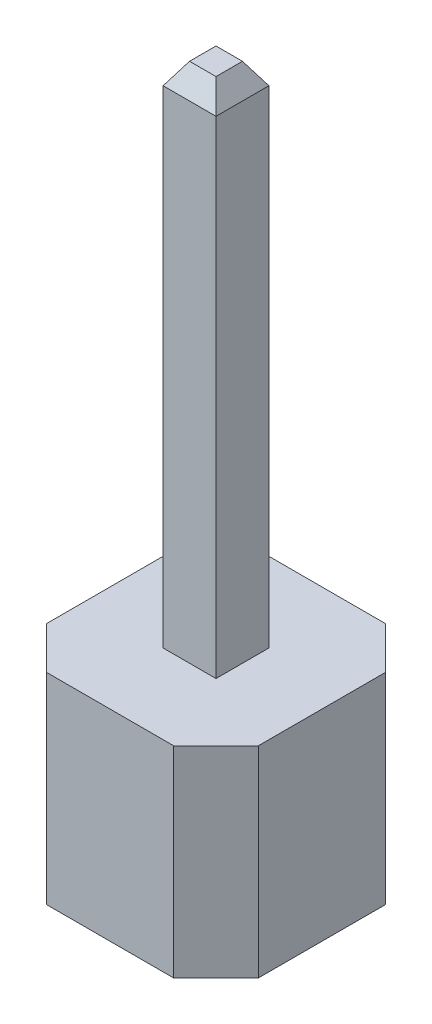
ISO-10303-21;
HEADER;
FILE_DESCRIPTION(('STEP AP214'),'2;1');
FILE_NAME('part.step','',(''),(''),'','','');
FILE_SCHEMA(('AUTOMOTIVE_DESIGN { 1 0 10303 214 1 1 1 1 }'));
ENDSEC;
DATA;
#1=APPLICATION_CONTEXT('core data for automotive mechanical design processes');
#2=APPLICATION_PROTOCOL_DEFINITION('international standard','automotive_design',2000,#1);
#3=PRODUCT_CONTEXT('',#1,'mechanical');
#4=PRODUCT('Part','Part','',(#3));
#5=PRODUCT_RELATED_PRODUCT_CATEGORY('part','',(#4));
#6=PRODUCT_DEFINITION_FORMATION('','',#4);
#7=PRODUCT_DEFINITION_CONTEXT('part definition',#1,'design');
#8=PRODUCT_DEFINITION('design','',#6,#7);
#9=PRODUCT_DEFINITION_SHAPE('','',#8);
#10=(LENGTH_UNIT() NAMED_UNIT(*) SI_UNIT(.MILLI.,.METRE.));
#11=(NAMED_UNIT(*) PLANE_ANGLE_UNIT() SI_UNIT($,.RADIAN.));
#12=(NAMED_UNIT(*) SI_UNIT($,.STERADIAN.) SOLID_ANGLE_UNIT());
#13=UNCERTAINTY_MEASURE_WITH_UNIT(LENGTH_MEASURE(1.E-05),#10,'distance_accuracy_value','');
#14=(GEOMETRIC_REPRESENTATION_CONTEXT(3) GLOBAL_UNCERTAINTY_ASSIGNED_CONTEXT((#13)) GLOBAL_UNIT_ASSIGNED_CONTEXT((#10,
#11,#12)) REPRESENTATION_CONTEXT('',''));
#15=CARTESIAN_POINT('',(0.,0.,0.));
#16=DIRECTION('',(0.,0.,1.));
#17=DIRECTION('',(1.,0.,0.));
#18=AXIS2_PLACEMENT_3D('',#15,#16,#17);
#19=CARTESIAN_POINT('',(0.,2.413,0.));
#20=DIRECTION('',(0.,1.,0.));
#21=DIRECTION('',(0.,0.,1.));
#22=AXIS2_PLACEMENT_3D('',#19,#20,#21);
#23=PLANE('',#22);
#24=DIRECTION('',(0.,0.,1.));
#25=VECTOR('',#24,1.);
#26=CARTESIAN_POINT('',(-1.27,2.413,-1.27));
#27=LINE('',#26,#25);
#28=CARTESIAN_POINT('',(-1.27,2.413,-0.761999999999999));
#29=VERTEX_POINT('',#28);
#30=CARTESIAN_POINT('',(-1.27,2.413,0.761999999999999));
#31=VERTEX_POINT('',#30);
#32=EDGE_CURVE('E171',#29,#31,#27,.T.);
#33=ORIENTED_EDGE('',*,*,#32,.T.);
#34=DIRECTION('',(-0.707106781186546,0.,-0.707106781186549));
#35=VECTOR('',#34,1.);
#36=CARTESIAN_POINT('',(-1.016,2.413,1.016));
#37=LINE('',#36,#35);
#38=CARTESIAN_POINT('',(-0.762,2.413,1.27));
#39=VERTEX_POINT('',#38);
#40=EDGE_CURVE('E211',#31,#39,#37,.F.);
#41=ORIENTED_EDGE('',*,*,#40,.T.);
#42=DIRECTION('',(1.,0.,0.));
#43=VECTOR('',#42,1.);
#44=CARTESIAN_POINT('',(-1.27,2.413,1.27));
#45=LINE('',#44,#43);
#46=CARTESIAN_POINT('',(0.761999999999999,2.413,1.27));
#47=VERTEX_POINT('',#46);
#48=EDGE_CURVE('E174',#39,#47,#45,.T.);
#49=ORIENTED_EDGE('',*,*,#48,.T.);
#50=DIRECTION('',(-0.707106781186549,0.,0.707106781186546));
#51=VECTOR('',#50,1.);
#52=CARTESIAN_POINT('',(1.016,2.413,1.016));
#53=LINE('',#52,#51);
#54=CARTESIAN_POINT('',(1.27,2.413,0.762));
#55=VERTEX_POINT('',#54);
#56=EDGE_CURVE('E205',#47,#55,#53,.F.);
#57=ORIENTED_EDGE('',*,*,#56,.T.);
#58=DIRECTION('',(0.,0.,-1.));
#59=VECTOR('',#58,1.);
#60=CARTESIAN_POINT('',(1.27,2.413,-1.27));
#61=LINE('',#60,#59);
#62=CARTESIAN_POINT('',(1.27,2.413,-0.761999999999998));
#63=VERTEX_POINT('',#62);
#64=EDGE_CURVE('E164',#55,#63,#61,.T.);
#65=ORIENTED_EDGE('',*,*,#64,.T.);
#66=DIRECTION('',(0.707106781186547,0.,0.707106781186548));
#67=VECTOR('',#66,1.);
#68=CARTESIAN_POINT('',(1.016,2.413,-1.016));
#69=LINE('',#68,#67);
#70=CARTESIAN_POINT('',(0.762000000000001,2.413,-1.27));
#71=VERTEX_POINT('',#70);
#72=EDGE_CURVE('E207',#63,#71,#69,.F.);
#73=ORIENTED_EDGE('',*,*,#72,.T.);
#74=DIRECTION('',(-1.,0.,0.));
#75=VECTOR('',#74,1.);
#76=CARTESIAN_POINT('',(-1.27,2.413,-1.27));
#77=LINE('',#76,#75);
#78=CARTESIAN_POINT('',(-0.761999999999997,2.413,-1.27));
#79=VERTEX_POINT('',#78);
#80=EDGE_CURVE('E167',#71,#79,#77,.T.);
#81=ORIENTED_EDGE('',*,*,#80,.T.);
#82=DIRECTION('',(0.707106781186549,0.,-0.707106781186546));
#83=VECTOR('',#82,1.);
#84=CARTESIAN_POINT('',(-1.016,2.413,-1.016));
#85=LINE('',#84,#83);
#86=EDGE_CURVE('E209',#79,#29,#85,.F.);
#87=ORIENTED_EDGE('',*,*,#86,.T.);
#88=EDGE_LOOP('',(#33,#41,#49,#57,#65,#73,#81,#87));
#89=FACE_BOUND('',#88,.T.);
#90=DIRECTION('',(-1.,0.,0.));
#91=VECTOR('',#90,1.);
#92=CARTESIAN_POINT('',(-0.3175,2.413,-0.3175));
#93=LINE('',#92,#91);
#94=CARTESIAN_POINT('',(0.3175,2.413,-0.3175));
#95=VERTEX_POINT('',#94);
#96=CARTESIAN_POINT('',(-0.3175,2.413,-0.3175));
#97=VERTEX_POINT('',#96);
#98=EDGE_CURVE('E137',#95,#97,#93,.T.);
#99=ORIENTED_EDGE('',*,*,#98,.F.);
#100=DIRECTION('',(0.,0.,-1.));
#101=VECTOR('',#100,1.);
#102=CARTESIAN_POINT('',(0.3175,2.413,0.3175));
#103=LINE('',#102,#101);
#104=CARTESIAN_POINT('',(0.3175,2.413,0.3175));
#105=VERTEX_POINT('',#104);
#106=EDGE_CURVE('E145',#105,#95,#103,.T.);
#107=ORIENTED_EDGE('',*,*,#106,.F.);
#108=DIRECTION('',(1.,0.,0.));
#109=VECTOR('',#108,1.);
#110=CARTESIAN_POINT('',(-0.3175,2.413,0.3175));
#111=LINE('',#110,#109);
#112=CARTESIAN_POINT('',(-0.3175,2.413,0.3175));
#113=VERTEX_POINT('',#112);
#114=EDGE_CURVE('E156',#113,#105,#111,.T.);
#115=ORIENTED_EDGE('',*,*,#114,.F.);
#116=DIRECTION('',(0.,0.,1.));
#117=VECTOR('',#116,1.);
#118=CARTESIAN_POINT('',(-0.3175,2.413,0.3175));
#119=LINE('',#118,#117);
#120=EDGE_CURVE('E154',#97,#113,#119,.T.);
#121=ORIENTED_EDGE('',*,*,#120,.F.);
#122=EDGE_LOOP('',(#99,#107,#115,#121));
#123=FACE_BOUND('',#122,.T.);
#124=ADVANCED_FACE('F33',(#89,#123),#23,.T.);
#125=CARTESIAN_POINT('',(1.27,2.413,-1.27));
#126=DIRECTION('',(-1.,0.,0.));
#127=DIRECTION('',(0.,0.,1.));
#128=AXIS2_PLACEMENT_3D('',#125,#126,#127);
#129=PLANE('',#128);
#130=DIRECTION('',(0.,0.,-1.));
#131=VECTOR('',#130,1.);
#132=CARTESIAN_POINT('',(1.27,0.,-1.27));
#133=LINE('',#132,#131);
#134=CARTESIAN_POINT('',(1.27,0.,0.762));
#135=VERTEX_POINT('',#134);
#136=CARTESIAN_POINT('',(1.27,0.,-0.761999999999998));
#137=VERTEX_POINT('',#136);
#138=EDGE_CURVE('E141',#135,#137,#133,.T.);
#139=ORIENTED_EDGE('',*,*,#138,.T.);
#140=DIRECTION('',(0.,1.,0.));
#141=VECTOR('',#140,1.);
#142=CARTESIAN_POINT('',(1.27,2.413,-0.761999999999998));
#143=LINE('',#142,#141);
#144=EDGE_CURVE('E221',#137,#63,#143,.T.);
#145=ORIENTED_EDGE('',*,*,#144,.T.);
#146=ORIENTED_EDGE('',*,*,#64,.F.);
#147=DIRECTION('',(0.,-1.,0.));
#148=VECTOR('',#147,1.);
#149=CARTESIAN_POINT('',(1.27,2.413,0.762000000000001));
#150=LINE('',#149,#148);
#151=EDGE_CURVE('E218',#55,#135,#150,.T.);
#152=ORIENTED_EDGE('',*,*,#151,.T.);
#153=EDGE_LOOP('',(#139,#145,#146,#152));
#154=FACE_BOUND('',#153,.T.);
#155=ADVANCED_FACE('F272',(#154),#129,.F.);
#156=CARTESIAN_POINT('',(-1.27,2.413,-1.27));
#157=DIRECTION('',(0.,0.,1.));
#158=DIRECTION('',(1.,0.,0.));
#159=AXIS2_PLACEMENT_3D('',#156,#157,#158);
#160=PLANE('',#159);
#161=DIRECTION('',(-1.,0.,0.));
#162=VECTOR('',#161,1.);
#163=CARTESIAN_POINT('',(-1.27,0.,-1.27));
#164=LINE('',#163,#162);
#165=CARTESIAN_POINT('',(0.762000000000001,0.,-1.27));
#166=VERTEX_POINT('',#165);
#167=CARTESIAN_POINT('',(-0.761999999999997,0.,-1.27));
#168=VERTEX_POINT('',#167);
#169=EDGE_CURVE('E180',#166,#168,#164,.T.);
#170=ORIENTED_EDGE('',*,*,#169,.T.);
#171=DIRECTION('',(0.,1.,0.));
#172=VECTOR('',#171,1.);
#173=CARTESIAN_POINT('',(-0.761999999999997,2.413,-1.27));
#174=LINE('',#173,#172);
#175=EDGE_CURVE('E216',#168,#79,#174,.T.);
#176=ORIENTED_EDGE('',*,*,#175,.T.);
#177=ORIENTED_EDGE('',*,*,#80,.F.);
#178=DIRECTION('',(0.,-1.,0.));
#179=VECTOR('',#178,1.);
#180=CARTESIAN_POINT('',(0.762,2.413,-1.27));
#181=LINE('',#180,#179);
#182=EDGE_CURVE('E213',#71,#166,#181,.T.);
#183=ORIENTED_EDGE('',*,*,#182,.T.);
#184=EDGE_LOOP('',(#170,#176,#177,#183));
#185=FACE_BOUND('',#184,.T.);
#186=ADVANCED_FACE('F278',(#185),#160,.F.);
#187=CARTESIAN_POINT('',(-1.27,2.413,-1.27));
#188=DIRECTION('',(1.,0.,0.));
#189=DIRECTION('',(0.,0.,-1.));
#190=AXIS2_PLACEMENT_3D('',#187,#188,#189);
#191=PLANE('',#190);
#192=DIRECTION('',(0.,0.,1.));
#193=VECTOR('',#192,1.);
#194=CARTESIAN_POINT('',(-1.27,0.,-1.27));
#195=LINE('',#194,#193);
#196=CARTESIAN_POINT('',(-1.27,0.,-0.761999999999999));
#197=VERTEX_POINT('',#196);
#198=CARTESIAN_POINT('',(-1.27,0.,0.761999999999999));
#199=VERTEX_POINT('',#198);
#200=EDGE_CURVE('E183',#197,#199,#195,.T.);
#201=ORIENTED_EDGE('',*,*,#200,.T.);
#202=DIRECTION('',(0.,1.,0.));
#203=VECTOR('',#202,1.);
#204=CARTESIAN_POINT('',(-1.27,2.413,0.761999999999999));
#205=LINE('',#204,#203);
#206=EDGE_CURVE('E203',#199,#31,#205,.T.);
#207=ORIENTED_EDGE('',*,*,#206,.T.);
#208=ORIENTED_EDGE('',*,*,#32,.F.);
#209=DIRECTION('',(0.,-1.,0.));
#210=VECTOR('',#209,1.);
#211=CARTESIAN_POINT('',(-1.27,2.413,-0.761999999999999));
#212=LINE('',#211,#210);
#213=EDGE_CURVE('E200',#29,#197,#212,.T.);
#214=ORIENTED_EDGE('',*,*,#213,.T.);
#215=EDGE_LOOP('',(#201,#207,#208,#214));
#216=FACE_BOUND('',#215,.T.);
#217=ADVANCED_FACE('F292',(#216),#191,.F.);
#218=CARTESIAN_POINT('',(-1.27,2.413,1.27));
#219=DIRECTION('',(0.,0.,-1.));
#220=DIRECTION('',(-1.,0.,0.));
#221=AXIS2_PLACEMENT_3D('',#218,#219,#220);
#222=PLANE('',#221);
#223=ORIENTED_EDGE('',*,*,#48,.F.);
#224=DIRECTION('',(0.,-1.,0.));
#225=VECTOR('',#224,1.);
#226=CARTESIAN_POINT('',(-0.762,2.413,1.27));
#227=LINE('',#226,#225);
#228=CARTESIAN_POINT('',(-0.762,0.,1.27));
#229=VERTEX_POINT('',#228);
#230=EDGE_CURVE('E189',#39,#229,#227,.T.);
#231=ORIENTED_EDGE('',*,*,#230,.T.);
#232=DIRECTION('',(1.,0.,0.));
#233=VECTOR('',#232,1.);
#234=CARTESIAN_POINT('',(-1.27,0.,1.27));
#235=LINE('',#234,#233);
#236=CARTESIAN_POINT('',(0.762,0.,1.27));
#237=VERTEX_POINT('',#236);
#238=EDGE_CURVE('E168',#229,#237,#235,.T.);
#239=ORIENTED_EDGE('',*,*,#238,.T.);
#240=DIRECTION('',(0.,1.,0.));
#241=VECTOR('',#240,1.);
#242=CARTESIAN_POINT('',(0.762,2.413,1.27));
#243=LINE('',#242,#241);
#244=EDGE_CURVE('E177',#237,#47,#243,.T.);
#245=ORIENTED_EDGE('',*,*,#244,.T.);
#246=EDGE_LOOP('',(#223,#231,#239,#245));
#247=FACE_BOUND('',#246,.T.);
#248=ADVANCED_FACE('F288',(#247),#222,.F.);
#249=CARTESIAN_POINT('',(0.,0.,0.));
#250=DIRECTION('',(0.,1.,0.));
#251=DIRECTION('',(0.,0.,1.));
#252=AXIS2_PLACEMENT_3D('',#249,#250,#251);
#253=PLANE('',#252);
#254=ORIENTED_EDGE('',*,*,#238,.F.);
#255=DIRECTION('',(0.707106781186546,0.,0.707106781186549));
#256=VECTOR('',#255,1.);
#257=CARTESIAN_POINT('',(-0.762,0.,1.27));
#258=LINE('',#257,#256);
#259=EDGE_CURVE('E198',#229,#199,#258,.F.);
#260=ORIENTED_EDGE('',*,*,#259,.T.);
#261=ORIENTED_EDGE('',*,*,#200,.F.);
#262=DIRECTION('',(-0.707106781186549,0.,0.707106781186546));
#263=VECTOR('',#262,1.);
#264=CARTESIAN_POINT('',(-1.27,0.,-0.761999999999999));
#265=LINE('',#264,#263);
#266=EDGE_CURVE('E196',#197,#168,#265,.F.);
#267=ORIENTED_EDGE('',*,*,#266,.T.);
#268=ORIENTED_EDGE('',*,*,#169,.F.);
#269=DIRECTION('',(-0.707106781186547,0.,-0.707106781186548));
#270=VECTOR('',#269,1.);
#271=CARTESIAN_POINT('',(0.762,0.,-1.27));
#272=LINE('',#271,#270);
#273=EDGE_CURVE('E194',#166,#137,#272,.F.);
#274=ORIENTED_EDGE('',*,*,#273,.T.);
#275=ORIENTED_EDGE('',*,*,#138,.F.);
#276=DIRECTION('',(0.707106781186549,0.,-0.707106781186546));
#277=VECTOR('',#276,1.);
#278=CARTESIAN_POINT('',(1.27,0.,0.762000000000001));
#279=LINE('',#278,#277);
#280=EDGE_CURVE('E192',#135,#237,#279,.F.);
#281=ORIENTED_EDGE('',*,*,#280,.T.);
#282=EDGE_LOOP('',(#254,#260,#261,#267,#268,#274,#275,#281));
#283=FACE_BOUND('',#282,.T.);
#284=ADVANCED_FACE('F284',(#283),#253,.F.);
#285=CARTESIAN_POINT('',(-0.762,2.413,1.27));
#286=DIRECTION('',(0.707106781186549,0.,-0.707106781186546));
#287=DIRECTION('',(0.,-1.,0.));
#288=AXIS2_PLACEMENT_3D('',#285,#286,#287);
#289=PLANE('',#288);
#290=ORIENTED_EDGE('',*,*,#40,.F.);
#291=ORIENTED_EDGE('',*,*,#206,.F.);
#292=ORIENTED_EDGE('',*,*,#259,.F.);
#293=ORIENTED_EDGE('',*,*,#230,.F.);
#294=EDGE_LOOP('',(#290,#291,#292,#293));
#295=FACE_BOUND('',#294,.T.);
#296=ADVANCED_FACE('F287',(#295),#289,.F.);
#297=CARTESIAN_POINT('',(-1.27,2.413,-0.761999999999999));
#298=DIRECTION('',(0.707106781186546,0.,0.707106781186549));
#299=DIRECTION('',(0.,-1.,0.));
#300=AXIS2_PLACEMENT_3D('',#297,#298,#299);
#301=PLANE('',#300);
#302=ORIENTED_EDGE('',*,*,#86,.F.);
#303=ORIENTED_EDGE('',*,*,#175,.F.);
#304=ORIENTED_EDGE('',*,*,#266,.F.);
#305=ORIENTED_EDGE('',*,*,#213,.F.);
#306=EDGE_LOOP('',(#302,#303,#304,#305));
#307=FACE_BOUND('',#306,.T.);
#308=ADVANCED_FACE('F302',(#307),#301,.F.);
#309=CARTESIAN_POINT('',(0.762,2.413,-1.27));
#310=DIRECTION('',(-0.707106781186548,0.,0.707106781186547));
#311=DIRECTION('',(0.,-1.,0.));
#312=AXIS2_PLACEMENT_3D('',#309,#310,#311);
#313=PLANE('',#312);
#314=ORIENTED_EDGE('',*,*,#72,.F.);
#315=ORIENTED_EDGE('',*,*,#144,.F.);
#316=ORIENTED_EDGE('',*,*,#273,.F.);
#317=ORIENTED_EDGE('',*,*,#182,.F.);
#318=EDGE_LOOP('',(#314,#315,#316,#317));
#319=FACE_BOUND('',#318,.T.);
#320=ADVANCED_FACE('F306',(#319),#313,.F.);
#321=CARTESIAN_POINT('',(1.27,2.413,0.762000000000001));
#322=DIRECTION('',(-0.707106781186546,0.,-0.707106781186549));
#323=DIRECTION('',(0.,-1.,0.));
#324=AXIS2_PLACEMENT_3D('',#321,#322,#323);
#325=PLANE('',#324);
#326=ORIENTED_EDGE('',*,*,#56,.F.);
#327=ORIENTED_EDGE('',*,*,#244,.F.);
#328=ORIENTED_EDGE('',*,*,#280,.F.);
#329=ORIENTED_EDGE('',*,*,#151,.F.);
#330=EDGE_LOOP('',(#326,#327,#328,#329));
#331=FACE_BOUND('',#330,.T.);
#332=ADVANCED_FACE('F310',(#331),#325,.F.);
#333=CARTESIAN_POINT('',(0.3175,8.509,0.3175));
#334=DIRECTION('',(-1.,0.,0.));
#335=DIRECTION('',(0.,0.,1.));
#336=AXIS2_PLACEMENT_3D('',#333,#334,#335);
#337=PLANE('',#336);
#338=DIRECTION('',(0.,-1.,0.));
#339=VECTOR('',#338,1.);
#340=CARTESIAN_POINT('',(0.3175,8.509,-0.3175));
#341=LINE('',#340,#339);
#342=CARTESIAN_POINT('',(0.3175,8.255,-0.3175));
#343=VERTEX_POINT('',#342);
#344=EDGE_CURVE('E133',#343,#95,#341,.T.);
#345=ORIENTED_EDGE('',*,*,#344,.F.);
#346=DIRECTION('',(0.,0.,1.));
#347=VECTOR('',#346,1.);
#348=CARTESIAN_POINT('',(0.3175,8.255,0.3175));
#349=LINE('',#348,#347);
#350=CARTESIAN_POINT('',(0.3175,8.255,0.3175));
#351=VERTEX_POINT('',#350);
#352=EDGE_CURVE('E11',#343,#351,#349,.T.);
#353=ORIENTED_EDGE('',*,*,#352,.T.);
#354=DIRECTION('',(0.,-1.,0.));
#355=VECTOR('',#354,1.);
#356=CARTESIAN_POINT('',(0.3175,8.509,0.3175));
#357=LINE('',#356,#355);
#358=EDGE_CURVE('E148',#351,#105,#357,.T.);
#359=ORIENTED_EDGE('',*,*,#358,.T.);
#360=ORIENTED_EDGE('',*,*,#106,.T.);
#361=EDGE_LOOP('',(#345,#353,#359,#360));
#362=FACE_BOUND('',#361,.T.);
#363=ADVANCED_FACE('F146',(#362),#337,.F.);
#364=CARTESIAN_POINT('',(-0.3175,8.509,-0.3175));
#365=DIRECTION('',(0.,0.,1.));
#366=DIRECTION('',(1.,0.,0.));
#367=AXIS2_PLACEMENT_3D('',#364,#365,#366);
#368=PLANE('',#367);
#369=DIRECTION('',(0.,-1.,0.));
#370=VECTOR('',#369,1.);
#371=CARTESIAN_POINT('',(-0.3175,8.509,-0.3175));
#372=LINE('',#371,#370);
#373=CARTESIAN_POINT('',(-0.3175,8.255,-0.3175));
#374=VERTEX_POINT('',#373);
#375=EDGE_CURVE('E142',#374,#97,#372,.T.);
#376=ORIENTED_EDGE('',*,*,#375,.F.);
#377=DIRECTION('',(1.,0.,0.));
#378=VECTOR('',#377,1.);
#379=CARTESIAN_POINT('',(-0.3175,8.255,-0.3175));
#380=LINE('',#379,#378);
#381=EDGE_CURVE('E42',#374,#343,#380,.T.);
#382=ORIENTED_EDGE('',*,*,#381,.T.);
#383=ORIENTED_EDGE('',*,*,#344,.T.);
#384=ORIENTED_EDGE('',*,*,#98,.T.);
#385=EDGE_LOOP('',(#376,#382,#383,#384));
#386=FACE_BOUND('',#385,.T.);
#387=ADVANCED_FACE('F135',(#386),#368,.F.);
#388=CARTESIAN_POINT('',(-0.3175,8.509,0.3175));
#389=DIRECTION('',(1.,0.,0.));
#390=DIRECTION('',(0.,0.,-1.));
#391=AXIS2_PLACEMENT_3D('',#388,#389,#390);
#392=PLANE('',#391);
#393=DIRECTION('',(0.,-1.,0.));
#394=VECTOR('',#393,1.);
#395=CARTESIAN_POINT('',(-0.3175,8.509,0.3175));
#396=LINE('',#395,#394);
#397=CARTESIAN_POINT('',(-0.3175,8.255,0.3175));
#398=VERTEX_POINT('',#397);
#399=EDGE_CURVE('E161',#398,#113,#396,.T.);
#400=ORIENTED_EDGE('',*,*,#399,.F.);
#401=DIRECTION('',(0.,0.,-1.));
#402=VECTOR('',#401,1.);
#403=CARTESIAN_POINT('',(-0.3175,8.255,0.3175));
#404=LINE('',#403,#402);
#405=EDGE_CURVE('E57',#398,#374,#404,.T.);
#406=ORIENTED_EDGE('',*,*,#405,.T.);
#407=ORIENTED_EDGE('',*,*,#375,.T.);
#408=ORIENTED_EDGE('',*,*,#120,.T.);
#409=EDGE_LOOP('',(#400,#406,#407,#408));
#410=FACE_BOUND('',#409,.T.);
#411=ADVANCED_FACE('F269',(#410),#392,.F.);
#412=CARTESIAN_POINT('',(-0.3175,8.509,0.3175));
#413=DIRECTION('',(0.,0.,-1.));
#414=DIRECTION('',(-1.,0.,0.));
#415=AXIS2_PLACEMENT_3D('',#412,#413,#414);
#416=PLANE('',#415);
#417=ORIENTED_EDGE('',*,*,#358,.F.);
#418=DIRECTION('',(-1.,0.,0.));
#419=VECTOR('',#418,1.);
#420=CARTESIAN_POINT('',(-0.3175,8.255,0.3175));
#421=LINE('',#420,#419);
#422=EDGE_CURVE('E232',#351,#398,#421,.T.);
#423=ORIENTED_EDGE('',*,*,#422,.T.);
#424=ORIENTED_EDGE('',*,*,#399,.T.);
#425=ORIENTED_EDGE('',*,*,#114,.T.);
#426=EDGE_LOOP('',(#417,#423,#424,#425));
#427=FACE_BOUND('',#426,.T.);
#428=ADVANCED_FACE('F257',(#427),#416,.F.);
#429=CARTESIAN_POINT('',(0.,8.509,0.));
#430=DIRECTION('',(0.,-1.,0.));
#431=DIRECTION('',(0.,0.,-1.));
#432=AXIS2_PLACEMENT_3D('',#429,#430,#431);
#433=PLANE('',#432);
#434=DIRECTION('',(0.,0.,1.));
#435=VECTOR('',#434,1.);
#436=CARTESIAN_POINT('',(-0.158783184615032,8.509,0.));
#437=LINE('',#436,#435);
#438=CARTESIAN_POINT('',(-0.158783184615032,8.509,-0.158783184615032));
#439=VERTEX_POINT('',#438);
#440=CARTESIAN_POINT('',(-0.158783184615032,8.509,0.158783184615032));
#441=VERTEX_POINT('',#440);
#442=EDGE_CURVE('E227',#439,#441,#437,.T.);
#443=ORIENTED_EDGE('',*,*,#442,.T.);
#444=DIRECTION('',(1.,0.,0.));
#445=VECTOR('',#444,1.);
#446=CARTESIAN_POINT('',(0.,8.509,0.158783184615032));
#447=LINE('',#446,#445);
#448=CARTESIAN_POINT('',(0.158783184615032,8.509,0.158783184615032));
#449=VERTEX_POINT('',#448);
#450=EDGE_CURVE('E229',#441,#449,#447,.T.);
#451=ORIENTED_EDGE('',*,*,#450,.T.);
#452=DIRECTION('',(0.,0.,-1.));
#453=VECTOR('',#452,1.);
#454=CARTESIAN_POINT('',(0.158783184615032,8.509,0.));
#455=LINE('',#454,#453);
#456=CARTESIAN_POINT('',(0.158783184615032,8.509,-0.158783184615032));
#457=VERTEX_POINT('',#456);
#458=EDGE_CURVE('E223',#449,#457,#455,.T.);
#459=ORIENTED_EDGE('',*,*,#458,.T.);
#460=DIRECTION('',(-1.,0.,0.));
#461=VECTOR('',#460,1.);
#462=CARTESIAN_POINT('',(0.,8.509,-0.158783184615032));
#463=LINE('',#462,#461);
#464=EDGE_CURVE('E225',#457,#439,#463,.T.);
#465=ORIENTED_EDGE('',*,*,#464,.T.);
#466=EDGE_LOOP('',(#443,#451,#459,#465));
#467=FACE_BOUND('',#466,.T.);
#468=ADVANCED_FACE('F262',(#467),#433,.F.);
#469=CARTESIAN_POINT('',(0.,8.509,-0.158783184615032));
#470=DIRECTION('',(0.,-0.529919264233202,0.848048096156428));
#471=DIRECTION('',(-1.,0.,0.));
#472=AXIS2_PLACEMENT_3D('',#469,#470,#471);
#473=PLANE('',#472);
#474=DIRECTION('',(-0.468237942151899,0.749337346632816,0.468237942151899));
#475=VECTOR('',#474,1.);
#476=CARTESIAN_POINT('',(0.123970484183142,8.56471196655031,-0.123970484183142));
#477=LINE('',#476,#475);
#478=EDGE_CURVE('E240',#343,#457,#477,.T.);
#479=ORIENTED_EDGE('',*,*,#478,.F.);
#480=ORIENTED_EDGE('',*,*,#381,.F.);
#481=DIRECTION('',(0.468237942151899,0.749337346632816,0.468237942151899));
#482=VECTOR('',#481,1.);
#483=CARTESIAN_POINT('',(-0.123970484183142,8.56471196655031,-0.123970484183142));
#484=LINE('',#483,#482);
#485=EDGE_CURVE('E37',#439,#374,#484,.F.);
#486=ORIENTED_EDGE('',*,*,#485,.F.);
#487=ORIENTED_EDGE('',*,*,#464,.F.);
#488=EDGE_LOOP('',(#479,#480,#486,#487));
#489=FACE_BOUND('',#488,.T.);
#490=ADVANCED_FACE('F35',(#489),#473,.F.);
#491=CARTESIAN_POINT('',(-0.158783184615032,8.509,0.));
#492=DIRECTION('',(0.848048096156428,-0.529919264233202,0.));
#493=DIRECTION('',(0.,0.,1.));
#494=AXIS2_PLACEMENT_3D('',#491,#492,#493);
#495=PLANE('',#494);
#496=ORIENTED_EDGE('',*,*,#485,.T.);
#497=ORIENTED_EDGE('',*,*,#405,.F.);
#498=DIRECTION('',(0.468237942151899,0.749337346632816,-0.468237942151899));
#499=VECTOR('',#498,1.);
#500=CARTESIAN_POINT('',(-0.123970484183142,8.56471196655031,0.123970484183142));
#501=LINE('',#500,#499);
#502=EDGE_CURVE('E239',#441,#398,#501,.F.);
#503=ORIENTED_EDGE('',*,*,#502,.F.);
#504=ORIENTED_EDGE('',*,*,#442,.F.);
#505=EDGE_LOOP('',(#496,#497,#503,#504));
#506=FACE_BOUND('',#505,.T.);
#507=ADVANCED_FACE('F249',(#506),#495,.F.);
#508=CARTESIAN_POINT('',(0.158783184615032,8.509,0.));
#509=DIRECTION('',(-0.848048096156428,-0.529919264233202,0.));
#510=DIRECTION('',(0.,0.,-1.));
#511=AXIS2_PLACEMENT_3D('',#508,#509,#510);
#512=PLANE('',#511);
#513=ORIENTED_EDGE('',*,*,#478,.T.);
#514=ORIENTED_EDGE('',*,*,#458,.F.);
#515=DIRECTION('',(0.468237942151899,-0.749337346632816,0.468237942151899));
#516=VECTOR('',#515,1.);
#517=CARTESIAN_POINT('',(0.123970484183142,8.56471196655031,0.123970484183142));
#518=LINE('',#517,#516);
#519=EDGE_CURVE('E237',#351,#449,#518,.F.);
#520=ORIENTED_EDGE('',*,*,#519,.F.);
#521=ORIENTED_EDGE('',*,*,#352,.F.);
#522=EDGE_LOOP('',(#513,#514,#520,#521));
#523=FACE_BOUND('',#522,.T.);
#524=ADVANCED_FACE('F254',(#523),#512,.F.);
#525=CARTESIAN_POINT('',(0.,8.509,0.158783184615032));
#526=DIRECTION('',(0.,-0.529919264233202,-0.848048096156428));
#527=DIRECTION('',(1.,0.,0.));
#528=AXIS2_PLACEMENT_3D('',#525,#526,#527);
#529=PLANE('',#528);
#530=ORIENTED_EDGE('',*,*,#502,.T.);
#531=ORIENTED_EDGE('',*,*,#422,.F.);
#532=ORIENTED_EDGE('',*,*,#519,.T.);
#533=ORIENTED_EDGE('',*,*,#450,.F.);
#534=EDGE_LOOP('',(#530,#531,#532,#533));
#535=FACE_BOUND('',#534,.T.);
#536=ADVANCED_FACE('F259',(#535),#529,.F.);
#537=CLOSED_SHELL('',(#124,#155,#186,#217,#248,#284,#296,#308,#320,#332,#363,#387,#411,#428,
#468,#490,#507,#524,#536));
#538=MANIFOLD_SOLID_BREP('B2',#537);
#539=ADVANCED_BREP_SHAPE_REPRESENTATION('',(#18,#538),#14);
#540=SHAPE_DEFINITION_REPRESENTATION(#9,#539);
ENDSEC;
END-ISO-10303-21;
